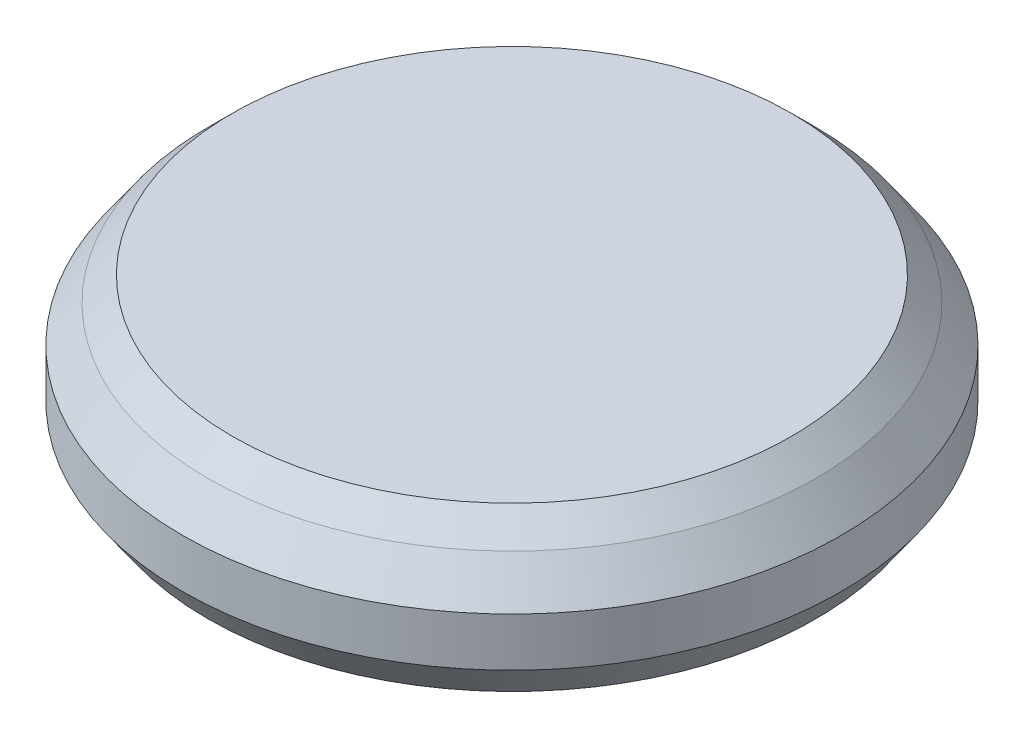
ISO-10303-21;
HEADER;
FILE_DESCRIPTION(('STEP AP214'),'2;1');
FILE_NAME('part.step','',(''),(''),'','','');
FILE_SCHEMA(('AUTOMOTIVE_DESIGN { 1 0 10303 214 1 1 1 1 }'));
ENDSEC;
DATA;
#1=APPLICATION_CONTEXT('core data for automotive mechanical design processes');
#2=APPLICATION_PROTOCOL_DEFINITION('international standard','automotive_design',2000,#1);
#3=PRODUCT_CONTEXT('',#1,'mechanical');
#4=PRODUCT('Part','Part','',(#3));
#5=PRODUCT_RELATED_PRODUCT_CATEGORY('part','',(#4));
#6=PRODUCT_DEFINITION_FORMATION('','',#4);
#7=PRODUCT_DEFINITION_CONTEXT('part definition',#1,'design');
#8=PRODUCT_DEFINITION('design','',#6,#7);
#9=PRODUCT_DEFINITION_SHAPE('','',#8);
#10=(LENGTH_UNIT() NAMED_UNIT(*) SI_UNIT(.MILLI.,.METRE.));
#11=(NAMED_UNIT(*) PLANE_ANGLE_UNIT() SI_UNIT($,.RADIAN.));
#12=(NAMED_UNIT(*) SI_UNIT($,.STERADIAN.) SOLID_ANGLE_UNIT());
#13=UNCERTAINTY_MEASURE_WITH_UNIT(LENGTH_MEASURE(1.E-05),#10,'distance_accuracy_value','');
#14=(GEOMETRIC_REPRESENTATION_CONTEXT(3) GLOBAL_UNCERTAINTY_ASSIGNED_CONTEXT((#13)) GLOBAL_UNIT_ASSIGNED_CONTEXT((#10,
#11,#12)) REPRESENTATION_CONTEXT('',''));
#15=CARTESIAN_POINT('',(0.,0.,0.));
#16=DIRECTION('',(0.,0.,1.));
#17=DIRECTION('',(1.,0.,0.));
#18=AXIS2_PLACEMENT_3D('',#15,#16,#17);
#19=CARTESIAN_POINT('',(0.,10.,0.));
#20=DIRECTION('',(0.,-1.,0.));
#21=DIRECTION('',(0.,0.,1.));
#22=AXIS2_PLACEMENT_3D('',#19,#20,#21);
#23=CONICAL_SURFACE('',#22,25.,0.78539816339745);
#24=CARTESIAN_POINT('',(0.,12.,0.));
#25=DIRECTION('',(0.,1.,0.));
#26=DIRECTION('',(0.,0.,1.));
#27=AXIS2_PLACEMENT_3D('',#24,#25,#26);
#28=CIRCLE('',#27,23.);
#29=CARTESIAN_POINT('',(0.,12.,23.));
#30=VERTEX_POINT('',#29);
#31=EDGE_CURVE('E11',#30,#30,#28,.T.);
#32=ORIENTED_EDGE('',*,*,#31,.F.);
#33=EDGE_LOOP('',(#32));
#34=FACE_BOUND('',#33,.T.);
#35=CARTESIAN_POINT('',(0.,10.,0.));
#36=DIRECTION('',(0.,1.,0.));
#37=DIRECTION('',(0.,0.,1.));
#38=AXIS2_PLACEMENT_3D('',#35,#36,#37);
#39=CIRCLE('',#38,25.);
#40=CARTESIAN_POINT('',(0.,10.,25.));
#41=VERTEX_POINT('',#40);
#42=EDGE_CURVE('E45',#41,#41,#39,.T.);
#43=ORIENTED_EDGE('',*,*,#42,.T.);
#44=EDGE_LOOP('',(#43));
#45=FACE_BOUND('',#44,.T.);
#46=ADVANCED_FACE('F39',(#34,#45),#23,.T.);
#47=CARTESIAN_POINT('',(0.,12.,0.));
#48=DIRECTION('',(0.,1.,0.));
#49=DIRECTION('',(0.,0.,1.));
#50=AXIS2_PLACEMENT_3D('',#47,#48,#49);
#51=PLANE('',#50);
#52=ORIENTED_EDGE('',*,*,#31,.T.);
#53=EDGE_LOOP('',(#52));
#54=FACE_BOUND('',#53,.T.);
#55=ADVANCED_FACE('F54',(#54),#51,.T.);
#56=CARTESIAN_POINT('',(0.,10.,0.));
#57=DIRECTION('',(0.,1.,0.));
#58=DIRECTION('',(0.,0.,1.));
#59=AXIS2_PLACEMENT_3D('',#56,#57,#58);
#60=PLANE('',#59);
#61=ORIENTED_EDGE('',*,*,#42,.F.);
#62=EDGE_LOOP('',(#61));
#63=FACE_BOUND('',#62,.T.);
#64=ADVANCED_FACE('F52',(#63),#60,.F.);
#65=CLOSED_SHELL('',(#46,#55,#64));
#66=MANIFOLD_SOLID_BREP('B2',#65);
#67=CARTESIAN_POINT('',(0.,0.,0.));
#68=DIRECTION('',(0.,1.,0.));
#69=DIRECTION('',(0.,0.,1.));
#70=AXIS2_PLACEMENT_3D('',#67,#68,#69);
#71=CONICAL_SURFACE('',#70,25.,0.610865238198017);
#72=CARTESIAN_POINT('',(0.,3.,0.));
#73=DIRECTION('',(0.,1.,0.));
#74=DIRECTION('',(0.,0.,1.));
#75=AXIS2_PLACEMENT_3D('',#72,#73,#74);
#76=CIRCLE('',#75,27.1006226146291);
#77=CARTESIAN_POINT('',(0.,3.,27.1006226146291));
#78=VERTEX_POINT('',#77);
#79=EDGE_CURVE('E38',#78,#78,#76,.T.);
#80=ORIENTED_EDGE('',*,*,#79,.F.);
#81=EDGE_LOOP('',(#80));
#82=FACE_BOUND('',#81,.T.);
#83=CARTESIAN_POINT('',(0.,0.,0.));
#84=DIRECTION('',(0.,1.,0.));
#85=DIRECTION('',(0.,0.,1.));
#86=AXIS2_PLACEMENT_3D('',#83,#84,#85);
#87=CIRCLE('',#86,25.);
#88=CARTESIAN_POINT('',(0.,0.,25.));
#89=VERTEX_POINT('',#88);
#90=EDGE_CURVE('E86',#89,#89,#87,.T.);
#91=ORIENTED_EDGE('',*,*,#90,.T.);
#92=EDGE_LOOP('',(#91));
#93=FACE_BOUND('',#92,.T.);
#94=ADVANCED_FACE('F80',(#82,#93),#71,.T.);
#95=CARTESIAN_POINT('',(0.,0.,0.));
#96=DIRECTION('',(0.,1.,0.));
#97=DIRECTION('',(0.,0.,1.));
#98=AXIS2_PLACEMENT_3D('',#95,#96,#97);
#99=PLANE('',#98);
#100=ORIENTED_EDGE('',*,*,#90,.F.);
#101=EDGE_LOOP('',(#100));
#102=FACE_BOUND('',#101,.T.);
#103=ADVANCED_FACE('F110',(#102),#99,.F.);
#104=CARTESIAN_POINT('',(0.,7.,0.));
#105=DIRECTION('',(0.,-1.,0.));
#106=DIRECTION('',(0.,0.,-1.));
#107=AXIS2_PLACEMENT_3D('',#104,#105,#106);
#108=CYLINDRICAL_SURFACE('',#107,27.1006226146291);
#109=CARTESIAN_POINT('',(0.,7.,0.));
#110=DIRECTION('',(0.,1.,0.));
#111=DIRECTION('',(0.,0.,1.));
#112=AXIS2_PLACEMENT_3D('',#109,#110,#111);
#113=CIRCLE('',#112,27.1006226146291);
#114=CARTESIAN_POINT('',(0.,7.,27.1006226146291));
#115=VERTEX_POINT('',#114);
#116=EDGE_CURVE('E90',#115,#115,#113,.T.);
#117=ORIENTED_EDGE('',*,*,#116,.F.);
#118=EDGE_LOOP('',(#117));
#119=FACE_BOUND('',#118,.T.);
#120=ORIENTED_EDGE('',*,*,#79,.T.);
#121=EDGE_LOOP('',(#120));
#122=FACE_BOUND('',#121,.T.);
#123=ADVANCED_FACE('F105',(#119,#122),#108,.T.);
#124=CARTESIAN_POINT('',(0.,7.,0.));
#125=DIRECTION('',(0.,-1.,0.));
#126=DIRECTION('',(0.,0.,1.));
#127=AXIS2_PLACEMENT_3D('',#124,#125,#126);
#128=CONICAL_SURFACE('',#127,27.1006226146291,0.610865238198017);
#129=CARTESIAN_POINT('',(0.,10.,0.));
#130=DIRECTION('',(0.,1.,0.));
#131=DIRECTION('',(0.,0.,1.));
#132=AXIS2_PLACEMENT_3D('',#129,#130,#131);
#133=CIRCLE('',#132,25.);
#134=CARTESIAN_POINT('',(0.,10.,25.));
#135=VERTEX_POINT('',#134);
#136=EDGE_CURVE('E94',#135,#135,#133,.T.);
#137=ORIENTED_EDGE('',*,*,#136,.F.);
#138=EDGE_LOOP('',(#137));
#139=FACE_BOUND('',#138,.T.);
#140=ORIENTED_EDGE('',*,*,#116,.T.);
#141=EDGE_LOOP('',(#140));
#142=FACE_BOUND('',#141,.T.);
#143=ADVANCED_FACE('F102',(#139,#142),#128,.T.);
#144=CARTESIAN_POINT('',(0.,10.,0.));
#145=DIRECTION('',(0.,1.,0.));
#146=DIRECTION('',(0.,0.,1.));
#147=AXIS2_PLACEMENT_3D('',#144,#145,#146);
#148=PLANE('',#147);
#149=ORIENTED_EDGE('',*,*,#136,.T.);
#150=EDGE_LOOP('',(#149));
#151=FACE_BOUND('',#150,.T.);
#152=ADVANCED_FACE('F100',(#151),#148,.T.);
#153=CLOSED_SHELL('',(#94,#103,#123,#143,#152));
#154=MANIFOLD_SOLID_BREP('B6',#153);
#155=ADVANCED_BREP_SHAPE_REPRESENTATION('',(#18,#66,#154),#14);
#156=SHAPE_DEFINITION_REPRESENTATION(#9,#155);
ENDSEC;
END-ISO-10303-21;
